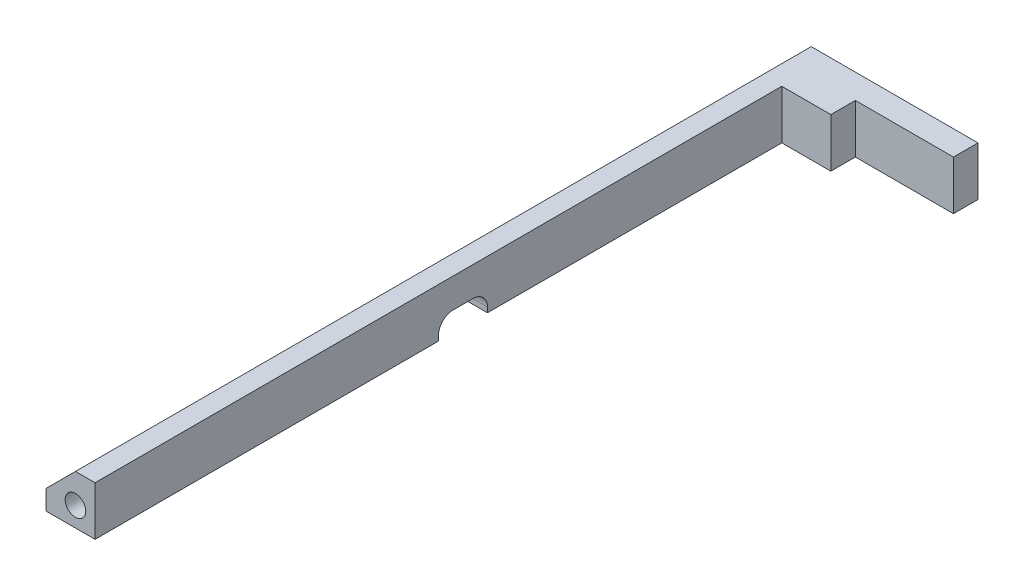
ISO-10303-21;
HEADER;
FILE_DESCRIPTION(('STEP AP214'),'2;1');
FILE_NAME('part.step','',(''),(''),'','','');
FILE_SCHEMA(('AUTOMOTIVE_DESIGN { 1 0 10303 214 1 1 1 1 }'));
ENDSEC;
DATA;
#1=APPLICATION_CONTEXT('core data for automotive mechanical design processes');
#2=APPLICATION_PROTOCOL_DEFINITION('international standard','automotive_design',2000,#1);
#3=PRODUCT_CONTEXT('',#1,'mechanical');
#4=PRODUCT('Part','Part','',(#3));
#5=PRODUCT_RELATED_PRODUCT_CATEGORY('part','',(#4));
#6=PRODUCT_DEFINITION_FORMATION('','',#4);
#7=PRODUCT_DEFINITION_CONTEXT('part definition',#1,'design');
#8=PRODUCT_DEFINITION('design','',#6,#7);
#9=PRODUCT_DEFINITION_SHAPE('','',#8);
#10=(LENGTH_UNIT() NAMED_UNIT(*) SI_UNIT(.MILLI.,.METRE.));
#11=(NAMED_UNIT(*) PLANE_ANGLE_UNIT() SI_UNIT($,.RADIAN.));
#12=(NAMED_UNIT(*) SI_UNIT($,.STERADIAN.) SOLID_ANGLE_UNIT());
#13=UNCERTAINTY_MEASURE_WITH_UNIT(LENGTH_MEASURE(1.E-05),#10,'distance_accuracy_value','');
#14=(GEOMETRIC_REPRESENTATION_CONTEXT(3) GLOBAL_UNCERTAINTY_ASSIGNED_CONTEXT((#13)) GLOBAL_UNIT_ASSIGNED_CONTEXT((#10,
#11,#12)) REPRESENTATION_CONTEXT('',''));
#15=CARTESIAN_POINT('',(0.,0.,0.));
#16=DIRECTION('',(0.,0.,1.));
#17=DIRECTION('',(1.,0.,0.));
#18=AXIS2_PLACEMENT_3D('',#15,#16,#17);
#19=CARTESIAN_POINT('',(0.,10.,0.));
#20=DIRECTION('',(1.,0.,0.));
#21=DIRECTION('',(0.,0.,-1.));
#22=AXIS2_PLACEMENT_3D('',#19,#20,#21);
#23=PLANE('',#22);
#24=DIRECTION('',(0.,0.,-1.));
#25=VECTOR('',#24,1.);
#26=CARTESIAN_POINT('',(0.,3.99999999999997,0.));
#27=LINE('',#26,#25);
#28=CARTESIAN_POINT('',(0.,3.99999999999997,0.));
#29=VERTEX_POINT('',#28);
#30=CARTESIAN_POINT('',(0.,3.99999999999997,-73.));
#31=VERTEX_POINT('',#30);
#32=EDGE_CURVE('E81',#29,#31,#27,.T.);
#33=ORIENTED_EDGE('',*,*,#32,.T.);
#34=CARTESIAN_POINT('',(0.,1.,-73.));
#35=DIRECTION('',(1.,0.,0.));
#36=DIRECTION('',(0.,0.,-1.));
#37=AXIS2_PLACEMENT_3D('',#34,#35,#36);
#38=CIRCLE('',#37,3.);
#39=CARTESIAN_POINT('',(0.,1.,-70.));
#40=VERTEX_POINT('',#39);
#41=EDGE_CURVE('E135',#31,#40,#38,.T.);
#42=ORIENTED_EDGE('',*,*,#41,.T.);
#43=DIRECTION('',(0.,-1.,0.));
#44=VECTOR('',#43,1.);
#45=CARTESIAN_POINT('',(0.,4.,-70.));
#46=LINE('',#45,#44);
#47=CARTESIAN_POINT('',(0.,0.,-70.));
#48=VERTEX_POINT('',#47);
#49=EDGE_CURVE('E112',#40,#48,#46,.T.);
#50=ORIENTED_EDGE('',*,*,#49,.T.);
#51=DIRECTION('',(0.,0.,1.));
#52=VECTOR('',#51,1.);
#53=CARTESIAN_POINT('',(0.,0.,0.));
#54=LINE('',#53,#52);
#55=CARTESIAN_POINT('',(0.,0.,0.));
#56=VERTEX_POINT('',#55);
#57=EDGE_CURVE('E198',#48,#56,#54,.T.);
#58=ORIENTED_EDGE('',*,*,#57,.T.);
#59=DIRECTION('',(0.,-1.,0.));
#60=VECTOR('',#59,1.);
#61=CARTESIAN_POINT('',(0.,10.,0.));
#62=LINE('',#61,#60);
#63=EDGE_CURVE('E188',#29,#56,#62,.T.);
#64=ORIENTED_EDGE('',*,*,#63,.F.);
#65=EDGE_LOOP('',(#33,#42,#50,#58,#64));
#66=FACE_BOUND('',#65,.T.);
#67=ADVANCED_FACE('F42',(#66),#23,.F.);
#68=CARTESIAN_POINT('',(0.,0.,0.));
#69=DIRECTION('',(0.,-1.,0.));
#70=DIRECTION('',(0.,0.,-1.));
#71=AXIS2_PLACEMENT_3D('',#68,#69,#70);
#72=PLANE('',#71);
#73=DIRECTION('',(-1.,0.,0.));
#74=VECTOR('',#73,1.);
#75=CARTESIAN_POINT('',(10.,0.,-70.));
#76=LINE('',#75,#74);
#77=CARTESIAN_POINT('',(10.,0.,-70.));
#78=VERTEX_POINT('',#77);
#79=EDGE_CURVE('E289',#78,#48,#76,.T.);
#80=ORIENTED_EDGE('',*,*,#79,.F.);
#81=DIRECTION('',(0.,0.,-1.));
#82=VECTOR('',#81,1.);
#83=CARTESIAN_POINT('',(9.99999999999998,0.,-140.));
#84=LINE('',#83,#82);
#85=CARTESIAN_POINT('',(10.,0.,0.));
#86=VERTEX_POINT('',#85);
#87=EDGE_CURVE('E126',#86,#78,#84,.T.);
#88=ORIENTED_EDGE('',*,*,#87,.F.);
#89=DIRECTION('',(1.,0.,0.));
#90=VECTOR('',#89,1.);
#91=CARTESIAN_POINT('',(10.,0.,0.));
#92=LINE('',#91,#90);
#93=EDGE_CURVE('E222',#56,#86,#92,.T.);
#94=ORIENTED_EDGE('',*,*,#93,.F.);
#95=ORIENTED_EDGE('',*,*,#57,.F.);
#96=EDGE_LOOP('',(#80,#88,#94,#95));
#97=FACE_BOUND('',#96,.T.);
#98=CARTESIAN_POINT('',(7.2,0.,-27.));
#99=DIRECTION('',(0.,-1.,0.));
#100=DIRECTION('',(0.,0.,-1.));
#101=AXIS2_PLACEMENT_3D('',#98,#99,#100);
#102=CIRCLE('',#101,2.1);
#103=CARTESIAN_POINT('',(7.2,0.,-29.1));
#104=VERTEX_POINT('',#103);
#105=EDGE_CURVE('E262',#104,#104,#102,.T.);
#106=ORIENTED_EDGE('',*,*,#105,.F.);
#107=EDGE_LOOP('',(#106));
#108=FACE_BOUND('',#107,.T.);
#109=ADVANCED_FACE('F334',(#97,#108),#72,.T.);
#110=CARTESIAN_POINT('',(10.,10.,0.));
#111=DIRECTION('',(0.,0.,-1.));
#112=DIRECTION('',(-1.,0.,0.));
#113=AXIS2_PLACEMENT_3D('',#110,#111,#112);
#114=PLANE('',#113);
#115=CARTESIAN_POINT('',(6.,4.,0.));
#116=DIRECTION('',(0.,0.,1.));
#117=DIRECTION('',(1.,0.,0.));
#118=AXIS2_PLACEMENT_3D('',#115,#116,#117);
#119=CIRCLE('',#118,2.1);
#120=CARTESIAN_POINT('',(8.1,4.,0.));
#121=VERTEX_POINT('',#120);
#122=EDGE_CURVE('E128',#121,#121,#119,.T.);
#123=ORIENTED_EDGE('',*,*,#122,.F.);
#124=EDGE_LOOP('',(#123));
#125=FACE_BOUND('',#124,.T.);
#126=DIRECTION('',(1.,0.,0.));
#127=VECTOR('',#126,1.);
#128=CARTESIAN_POINT('',(10.,10.,0.));
#129=LINE('',#128,#127);
#130=CARTESIAN_POINT('',(6.00000000000001,10.,0.));
#131=VERTEX_POINT('',#130);
#132=CARTESIAN_POINT('',(10.,10.,0.));
#133=VERTEX_POINT('',#132);
#134=EDGE_CURVE('E197',#131,#133,#129,.T.);
#135=ORIENTED_EDGE('',*,*,#134,.F.);
#136=DIRECTION('',(0.707106781186546,0.707106781186549,0.));
#137=VECTOR('',#136,1.);
#138=CARTESIAN_POINT('',(6.00000000000001,10.,0.));
#139=LINE('',#138,#137);
#140=EDGE_CURVE('E155',#131,#29,#139,.F.);
#141=ORIENTED_EDGE('',*,*,#140,.T.);
#142=ORIENTED_EDGE('',*,*,#63,.T.);
#143=ORIENTED_EDGE('',*,*,#93,.T.);
#144=DIRECTION('',(0.,-1.,0.));
#145=VECTOR('',#144,1.);
#146=CARTESIAN_POINT('',(10.,10.,0.));
#147=LINE('',#146,#145);
#148=EDGE_CURVE('E162',#133,#86,#147,.T.);
#149=ORIENTED_EDGE('',*,*,#148,.F.);
#150=EDGE_LOOP('',(#135,#141,#142,#143,#149));
#151=FACE_BOUND('',#150,.T.);
#152=ADVANCED_FACE('F330',(#125,#151),#114,.F.);
#153=CARTESIAN_POINT('',(9.99999999999998,10.,-140.));
#154=DIRECTION('',(-1.,0.,0.));
#155=DIRECTION('',(0.,0.,1.));
#156=AXIS2_PLACEMENT_3D('',#153,#154,#155);
#157=PLANE('',#156);
#158=ORIENTED_EDGE('',*,*,#87,.T.);
#159=DIRECTION('',(0.,-1.,0.));
#160=VECTOR('',#159,1.);
#161=CARTESIAN_POINT('',(10.,4.,-70.));
#162=LINE('',#161,#160);
#163=CARTESIAN_POINT('',(10.,1.,-70.));
#164=VERTEX_POINT('',#163);
#165=EDGE_CURVE('E109',#164,#78,#162,.T.);
#166=ORIENTED_EDGE('',*,*,#165,.F.);
#167=CARTESIAN_POINT('',(9.99999999999999,1.,-73.));
#168=DIRECTION('',(-1.,0.,0.));
#169=DIRECTION('',(0.,0.,1.));
#170=AXIS2_PLACEMENT_3D('',#167,#168,#169);
#171=CIRCLE('',#170,3.);
#172=CARTESIAN_POINT('',(10.,4.,-73.));
#173=VERTEX_POINT('',#172);
#174=EDGE_CURVE('E122',#164,#173,#171,.T.);
#175=ORIENTED_EDGE('',*,*,#174,.T.);
#176=DIRECTION('',(0.,0.,1.));
#177=VECTOR('',#176,1.);
#178=CARTESIAN_POINT('',(10.,4.,-80.));
#179=LINE('',#178,#177);
#180=CARTESIAN_POINT('',(10.,4.,-77.));
#181=VERTEX_POINT('',#180);
#182=EDGE_CURVE('E278',#181,#173,#179,.T.);
#183=ORIENTED_EDGE('',*,*,#182,.F.);
#184=CARTESIAN_POINT('',(9.99999999999999,1.,-77.));
#185=DIRECTION('',(-1.,0.,0.));
#186=DIRECTION('',(0.,0.,1.));
#187=AXIS2_PLACEMENT_3D('',#184,#185,#186);
#188=CIRCLE('',#187,3.);
#189=CARTESIAN_POINT('',(10.,1.,-80.));
#190=VERTEX_POINT('',#189);
#191=EDGE_CURVE('E51',#181,#190,#188,.T.);
#192=ORIENTED_EDGE('',*,*,#191,.T.);
#193=DIRECTION('',(0.,-1.,0.));
#194=VECTOR('',#193,1.);
#195=CARTESIAN_POINT('',(10.,4.,-80.));
#196=LINE('',#195,#194);
#197=CARTESIAN_POINT('',(10.,0.,-80.));
#198=VERTEX_POINT('',#197);
#199=EDGE_CURVE('E129',#190,#198,#196,.T.);
#200=ORIENTED_EDGE('',*,*,#199,.T.);
#201=CARTESIAN_POINT('',(9.99999999999998,0.,-140.));
#202=VERTEX_POINT('',#201);
#203=EDGE_CURVE('E221',#198,#202,#84,.T.);
#204=ORIENTED_EDGE('',*,*,#203,.T.);
#205=DIRECTION('',(0.,-1.,0.));
#206=VECTOR('',#205,1.);
#207=CARTESIAN_POINT('',(9.99999999999998,10.,-140.));
#208=LINE('',#207,#206);
#209=CARTESIAN_POINT('',(9.99999999999998,10.,-140.));
#210=VERTEX_POINT('',#209);
#211=EDGE_CURVE('E165',#210,#202,#208,.T.);
#212=ORIENTED_EDGE('',*,*,#211,.F.);
#213=DIRECTION('',(0.,0.,-1.));
#214=VECTOR('',#213,1.);
#215=CARTESIAN_POINT('',(9.99999999999998,10.,-140.));
#216=LINE('',#215,#214);
#217=EDGE_CURVE('E246',#133,#210,#216,.T.);
#218=ORIENTED_EDGE('',*,*,#217,.F.);
#219=ORIENTED_EDGE('',*,*,#148,.T.);
#220=EDGE_LOOP('',(#158,#166,#175,#183,#192,#200,#204,#212,#218,#219));
#221=FACE_BOUND('',#220,.T.);
#222=ADVANCED_FACE('F120',(#221),#157,.F.);
#223=CARTESIAN_POINT('',(20.,10.,-140.));
#224=DIRECTION('',(0.,0.,-1.));
#225=DIRECTION('',(-1.,0.,0.));
#226=AXIS2_PLACEMENT_3D('',#223,#224,#225);
#227=PLANE('',#226);
#228=DIRECTION('',(1.,0.,0.));
#229=VECTOR('',#228,1.);
#230=CARTESIAN_POINT('',(20.,0.,-140.));
#231=LINE('',#230,#229);
#232=CARTESIAN_POINT('',(20.,0.,-140.));
#233=VERTEX_POINT('',#232);
#234=EDGE_CURVE('E215',#202,#233,#231,.T.);
#235=ORIENTED_EDGE('',*,*,#234,.T.);
#236=DIRECTION('',(0.,-1.,0.));
#237=VECTOR('',#236,1.);
#238=CARTESIAN_POINT('',(20.,10.,-140.));
#239=LINE('',#238,#237);
#240=CARTESIAN_POINT('',(20.,10.,-140.));
#241=VERTEX_POINT('',#240);
#242=EDGE_CURVE('E169',#241,#233,#239,.T.);
#243=ORIENTED_EDGE('',*,*,#242,.F.);
#244=DIRECTION('',(1.,0.,0.));
#245=VECTOR('',#244,1.);
#246=CARTESIAN_POINT('',(20.,10.,-140.));
#247=LINE('',#246,#245);
#248=EDGE_CURVE('E242',#210,#241,#247,.T.);
#249=ORIENTED_EDGE('',*,*,#248,.F.);
#250=ORIENTED_EDGE('',*,*,#211,.T.);
#251=EDGE_LOOP('',(#235,#243,#249,#250));
#252=FACE_BOUND('',#251,.T.);
#253=ADVANCED_FACE('F414',(#252),#227,.F.);
#254=CARTESIAN_POINT('',(20.,10.,-145.));
#255=DIRECTION('',(-1.,0.,0.));
#256=DIRECTION('',(0.,0.,1.));
#257=AXIS2_PLACEMENT_3D('',#254,#255,#256);
#258=PLANE('',#257);
#259=DIRECTION('',(0.,0.,-1.));
#260=VECTOR('',#259,1.);
#261=CARTESIAN_POINT('',(20.,0.,-145.));
#262=LINE('',#261,#260);
#263=CARTESIAN_POINT('',(20.,0.,-145.));
#264=VERTEX_POINT('',#263);
#265=EDGE_CURVE('E211',#233,#264,#262,.T.);
#266=ORIENTED_EDGE('',*,*,#265,.T.);
#267=DIRECTION('',(0.,-1.,0.));
#268=VECTOR('',#267,1.);
#269=CARTESIAN_POINT('',(20.,10.,-145.));
#270=LINE('',#269,#268);
#271=CARTESIAN_POINT('',(20.,10.,-145.));
#272=VERTEX_POINT('',#271);
#273=EDGE_CURVE('E173',#272,#264,#270,.T.);
#274=ORIENTED_EDGE('',*,*,#273,.F.);
#275=DIRECTION('',(0.,0.,-1.));
#276=VECTOR('',#275,1.);
#277=CARTESIAN_POINT('',(20.,10.,-145.));
#278=LINE('',#277,#276);
#279=EDGE_CURVE('E238',#241,#272,#278,.T.);
#280=ORIENTED_EDGE('',*,*,#279,.F.);
#281=ORIENTED_EDGE('',*,*,#242,.T.);
#282=EDGE_LOOP('',(#266,#274,#280,#281));
#283=FACE_BOUND('',#282,.T.);
#284=ADVANCED_FACE('F410',(#283),#258,.F.);
#285=CARTESIAN_POINT('',(40.,10.,-145.));
#286=DIRECTION('',(0.,0.,-1.));
#287=DIRECTION('',(-1.,0.,0.));
#288=AXIS2_PLACEMENT_3D('',#285,#286,#287);
#289=PLANE('',#288);
#290=DIRECTION('',(1.,0.,0.));
#291=VECTOR('',#290,1.);
#292=CARTESIAN_POINT('',(40.,0.,-145.));
#293=LINE('',#292,#291);
#294=CARTESIAN_POINT('',(40.,0.,-145.));
#295=VERTEX_POINT('',#294);
#296=EDGE_CURVE('E207',#264,#295,#293,.T.);
#297=ORIENTED_EDGE('',*,*,#296,.T.);
#298=DIRECTION('',(0.,-1.,0.));
#299=VECTOR('',#298,1.);
#300=CARTESIAN_POINT('',(40.,10.,-145.));
#301=LINE('',#300,#299);
#302=CARTESIAN_POINT('',(40.,10.,-145.));
#303=VERTEX_POINT('',#302);
#304=EDGE_CURVE('E177',#303,#295,#301,.T.);
#305=ORIENTED_EDGE('',*,*,#304,.F.);
#306=DIRECTION('',(1.,0.,0.));
#307=VECTOR('',#306,1.);
#308=CARTESIAN_POINT('',(40.,10.,-145.));
#309=LINE('',#308,#307);
#310=EDGE_CURVE('E234',#272,#303,#309,.T.);
#311=ORIENTED_EDGE('',*,*,#310,.F.);
#312=ORIENTED_EDGE('',*,*,#273,.T.);
#313=EDGE_LOOP('',(#297,#305,#311,#312));
#314=FACE_BOUND('',#313,.T.);
#315=ADVANCED_FACE('F404',(#314),#289,.F.);
#316=CARTESIAN_POINT('',(40.,10.,-150.));
#317=DIRECTION('',(-1.,0.,0.));
#318=DIRECTION('',(0.,0.,1.));
#319=AXIS2_PLACEMENT_3D('',#316,#317,#318);
#320=PLANE('',#319);
#321=DIRECTION('',(0.,0.,-1.));
#322=VECTOR('',#321,1.);
#323=CARTESIAN_POINT('',(40.,0.,-150.));
#324=LINE('',#323,#322);
#325=CARTESIAN_POINT('',(40.,0.,-150.));
#326=VERTEX_POINT('',#325);
#327=EDGE_CURVE('E203',#295,#326,#324,.T.);
#328=ORIENTED_EDGE('',*,*,#327,.T.);
#329=DIRECTION('',(0.,-1.,0.));
#330=VECTOR('',#329,1.);
#331=CARTESIAN_POINT('',(40.,10.,-150.));
#332=LINE('',#331,#330);
#333=CARTESIAN_POINT('',(40.,10.,-150.));
#334=VERTEX_POINT('',#333);
#335=EDGE_CURVE('E181',#334,#326,#332,.T.);
#336=ORIENTED_EDGE('',*,*,#335,.F.);
#337=DIRECTION('',(0.,0.,-1.));
#338=VECTOR('',#337,1.);
#339=CARTESIAN_POINT('',(40.,10.,-150.));
#340=LINE('',#339,#338);
#341=EDGE_CURVE('E230',#303,#334,#340,.T.);
#342=ORIENTED_EDGE('',*,*,#341,.F.);
#343=ORIENTED_EDGE('',*,*,#304,.T.);
#344=EDGE_LOOP('',(#328,#336,#342,#343));
#345=FACE_BOUND('',#344,.T.);
#346=ADVANCED_FACE('F399',(#345),#320,.F.);
#347=CARTESIAN_POINT('',(0.,10.,-150.));
#348=DIRECTION('',(0.,0.,1.));
#349=DIRECTION('',(1.,0.,0.));
#350=AXIS2_PLACEMENT_3D('',#347,#348,#349);
#351=PLANE('',#350);
#352=DIRECTION('',(0.,-1.,0.));
#353=VECTOR('',#352,1.);
#354=CARTESIAN_POINT('',(0.,10.,-150.));
#355=LINE('',#354,#353);
#356=CARTESIAN_POINT('',(0.,3.99999999999997,-150.));
#357=VERTEX_POINT('',#356);
#358=CARTESIAN_POINT('',(0.,0.,-150.));
#359=VERTEX_POINT('',#358);
#360=EDGE_CURVE('E185',#357,#359,#355,.T.);
#361=ORIENTED_EDGE('',*,*,#360,.F.);
#362=DIRECTION('',(-0.707106781186546,-0.707106781186549,0.));
#363=VECTOR('',#362,1.);
#364=CARTESIAN_POINT('',(6.00000000000001,10.,-150.));
#365=LINE('',#364,#363);
#366=CARTESIAN_POINT('',(6.00000000000001,10.,-150.));
#367=VERTEX_POINT('',#366);
#368=EDGE_CURVE('E149',#357,#367,#365,.F.);
#369=ORIENTED_EDGE('',*,*,#368,.T.);
#370=DIRECTION('',(-1.,0.,0.));
#371=VECTOR('',#370,1.);
#372=CARTESIAN_POINT('',(0.,10.,-150.));
#373=LINE('',#372,#371);
#374=EDGE_CURVE('E192',#334,#367,#373,.T.);
#375=ORIENTED_EDGE('',*,*,#374,.F.);
#376=ORIENTED_EDGE('',*,*,#335,.T.);
#377=DIRECTION('',(-1.,0.,0.));
#378=VECTOR('',#377,1.);
#379=CARTESIAN_POINT('',(0.,0.,-150.));
#380=LINE('',#379,#378);
#381=EDGE_CURVE('E199',#326,#359,#380,.T.);
#382=ORIENTED_EDGE('',*,*,#381,.T.);
#383=EDGE_LOOP('',(#361,#369,#375,#376,#382));
#384=FACE_BOUND('',#383,.T.);
#385=ADVANCED_FACE('F365',(#384),#351,.F.);
#386=CARTESIAN_POINT('',(0.,0.,-80.));
#387=VERTEX_POINT('',#386);
#388=EDGE_CURVE('E193',#359,#387,#54,.T.);
#389=ORIENTED_EDGE('',*,*,#388,.T.);
#390=DIRECTION('',(0.,-1.,0.));
#391=VECTOR('',#390,1.);
#392=CARTESIAN_POINT('',(0.,4.,-80.));
#393=LINE('',#392,#391);
#394=CARTESIAN_POINT('',(0.,1.,-80.));
#395=VERTEX_POINT('',#394);
#396=EDGE_CURVE('E277',#395,#387,#393,.T.);
#397=ORIENTED_EDGE('',*,*,#396,.F.);
#398=CARTESIAN_POINT('',(0.,1.,-77.));
#399=DIRECTION('',(1.,0.,0.));
#400=DIRECTION('',(0.,0.,-1.));
#401=AXIS2_PLACEMENT_3D('',#398,#399,#400);
#402=CIRCLE('',#401,3.);
#403=CARTESIAN_POINT('',(0.,4.,-77.));
#404=VERTEX_POINT('',#403);
#405=EDGE_CURVE('E11',#395,#404,#402,.T.);
#406=ORIENTED_EDGE('',*,*,#405,.T.);
#407=EDGE_CURVE('E58',#404,#357,#27,.T.);
#408=ORIENTED_EDGE('',*,*,#407,.T.);
#409=ORIENTED_EDGE('',*,*,#360,.T.);
#410=EDGE_LOOP('',(#389,#397,#406,#408,#409));
#411=FACE_BOUND('',#410,.T.);
#412=ADVANCED_FACE('F299',(#411),#23,.F.);
#413=CARTESIAN_POINT('',(0.,10.,0.));
#414=DIRECTION('',(0.,-1.,0.));
#415=DIRECTION('',(0.,0.,-1.));
#416=AXIS2_PLACEMENT_3D('',#413,#414,#415);
#417=PLANE('',#416);
#418=ORIENTED_EDGE('',*,*,#374,.T.);
#419=DIRECTION('',(0.,0.,1.));
#420=VECTOR('',#419,1.);
#421=CARTESIAN_POINT('',(6.00000000000001,10.,0.));
#422=LINE('',#421,#420);
#423=EDGE_CURVE('E158',#367,#131,#422,.T.);
#424=ORIENTED_EDGE('',*,*,#423,.T.);
#425=ORIENTED_EDGE('',*,*,#134,.T.);
#426=ORIENTED_EDGE('',*,*,#217,.T.);
#427=ORIENTED_EDGE('',*,*,#248,.T.);
#428=ORIENTED_EDGE('',*,*,#279,.T.);
#429=ORIENTED_EDGE('',*,*,#310,.T.);
#430=ORIENTED_EDGE('',*,*,#341,.T.);
#431=EDGE_LOOP('',(#418,#424,#425,#426,#427,#428,#429,#430));
#432=FACE_BOUND('',#431,.T.);
#433=ADVANCED_FACE('F367',(#432),#417,.F.);
#434=DIRECTION('',(1.,0.,0.));
#435=VECTOR('',#434,1.);
#436=CARTESIAN_POINT('',(0.,0.,-80.));
#437=LINE('',#436,#435);
#438=EDGE_CURVE('E284',#387,#198,#437,.T.);
#439=ORIENTED_EDGE('',*,*,#438,.F.);
#440=ORIENTED_EDGE('',*,*,#388,.F.);
#441=ORIENTED_EDGE('',*,*,#381,.F.);
#442=ORIENTED_EDGE('',*,*,#327,.F.);
#443=ORIENTED_EDGE('',*,*,#296,.F.);
#444=ORIENTED_EDGE('',*,*,#265,.F.);
#445=ORIENTED_EDGE('',*,*,#234,.F.);
#446=ORIENTED_EDGE('',*,*,#203,.F.);
#447=EDGE_LOOP('',(#439,#440,#441,#442,#443,#444,#445,#446));
#448=FACE_BOUND('',#447,.T.);
#449=CARTESIAN_POINT('',(7.20000000000002,0.,-123.));
#450=DIRECTION('',(0.,-1.,0.));
#451=DIRECTION('',(0.,0.,-1.));
#452=AXIS2_PLACEMENT_3D('',#449,#450,#451);
#453=CIRCLE('',#452,2.1);
#454=CARTESIAN_POINT('',(7.20000000000002,0.,-125.1));
#455=VERTEX_POINT('',#454);
#456=EDGE_CURVE('E253',#455,#455,#453,.T.);
#457=ORIENTED_EDGE('',*,*,#456,.F.);
#458=EDGE_LOOP('',(#457));
#459=FACE_BOUND('',#458,.T.);
#460=ADVANCED_FACE('F311',(#448,#459),#72,.T.);
#461=CARTESIAN_POINT('',(7.20000000000002,4.,-123.));
#462=DIRECTION('',(0.,-1.,0.));
#463=DIRECTION('',(0.,0.,-1.));
#464=AXIS2_PLACEMENT_3D('',#461,#462,#463);
#465=CYLINDRICAL_SURFACE('',#464,2.1);
#466=CARTESIAN_POINT('',(7.20000000000002,4.,-123.));
#467=DIRECTION('',(0.,-1.,0.));
#468=DIRECTION('',(0.,0.,-1.));
#469=AXIS2_PLACEMENT_3D('',#466,#467,#468);
#470=CIRCLE('',#469,2.1);
#471=CARTESIAN_POINT('',(7.20000000000002,4.,-125.1));
#472=VERTEX_POINT('',#471);
#473=EDGE_CURVE('E257',#472,#472,#470,.T.);
#474=ORIENTED_EDGE('',*,*,#473,.F.);
#475=EDGE_LOOP('',(#474));
#476=FACE_BOUND('',#475,.T.);
#477=ORIENTED_EDGE('',*,*,#456,.T.);
#478=EDGE_LOOP('',(#477));
#479=FACE_BOUND('',#478,.T.);
#480=ADVANCED_FACE('F445',(#476,#479),#465,.F.);
#481=CARTESIAN_POINT('',(7.20000000000002,4.,-123.));
#482=DIRECTION('',(0.,-1.,0.));
#483=DIRECTION('',(0.,0.,-1.));
#484=AXIS2_PLACEMENT_3D('',#481,#482,#483);
#485=PLANE('',#484);
#486=ORIENTED_EDGE('',*,*,#473,.T.);
#487=EDGE_LOOP('',(#486));
#488=FACE_BOUND('',#487,.T.);
#489=ADVANCED_FACE('F441',(#488),#485,.T.);
#490=CARTESIAN_POINT('',(7.2,4.,-27.));
#491=DIRECTION('',(0.,-1.,0.));
#492=DIRECTION('',(0.,0.,-1.));
#493=AXIS2_PLACEMENT_3D('',#490,#491,#492);
#494=CYLINDRICAL_SURFACE('',#493,2.1);
#495=CARTESIAN_POINT('',(7.2,4.,-27.));
#496=DIRECTION('',(0.,-1.,0.));
#497=DIRECTION('',(0.,0.,-1.));
#498=AXIS2_PLACEMENT_3D('',#495,#496,#497);
#499=CIRCLE('',#498,2.1);
#500=CARTESIAN_POINT('',(7.2,4.,-29.1));
#501=VERTEX_POINT('',#500);
#502=EDGE_CURVE('E226',#501,#501,#499,.T.);
#503=ORIENTED_EDGE('',*,*,#502,.F.);
#504=EDGE_LOOP('',(#503));
#505=FACE_BOUND('',#504,.T.);
#506=ORIENTED_EDGE('',*,*,#105,.T.);
#507=EDGE_LOOP('',(#506));
#508=FACE_BOUND('',#507,.T.);
#509=ADVANCED_FACE('F434',(#505,#508),#494,.F.);
#510=CARTESIAN_POINT('',(7.2,4.,-27.));
#511=DIRECTION('',(0.,-1.,0.));
#512=DIRECTION('',(0.,0.,-1.));
#513=AXIS2_PLACEMENT_3D('',#510,#511,#512);
#514=PLANE('',#513);
#515=ORIENTED_EDGE('',*,*,#502,.T.);
#516=EDGE_LOOP('',(#515));
#517=FACE_BOUND('',#516,.T.);
#518=ADVANCED_FACE('F428',(#517),#514,.T.);
#519=CARTESIAN_POINT('',(6.,4.,-4.));
#520=DIRECTION('',(0.,0.,1.));
#521=DIRECTION('',(1.,0.,0.));
#522=AXIS2_PLACEMENT_3D('',#519,#520,#521);
#523=CYLINDRICAL_SURFACE('',#522,2.1);
#524=CARTESIAN_POINT('',(6.,4.,-4.));
#525=DIRECTION('',(0.,0.,1.));
#526=DIRECTION('',(1.,0.,0.));
#527=AXIS2_PLACEMENT_3D('',#524,#525,#526);
#528=CIRCLE('',#527,2.1);
#529=CARTESIAN_POINT('',(8.1,4.,-4.));
#530=VERTEX_POINT('',#529);
#531=EDGE_CURVE('E258',#530,#530,#528,.T.);
#532=ORIENTED_EDGE('',*,*,#531,.F.);
#533=EDGE_LOOP('',(#532));
#534=FACE_BOUND('',#533,.T.);
#535=ORIENTED_EDGE('',*,*,#122,.T.);
#536=EDGE_LOOP('',(#535));
#537=FACE_BOUND('',#536,.T.);
#538=ADVANCED_FACE('F381',(#534,#537),#523,.F.);
#539=CARTESIAN_POINT('',(6.,4.,-4.));
#540=DIRECTION('',(0.,0.,1.));
#541=DIRECTION('',(1.,0.,0.));
#542=AXIS2_PLACEMENT_3D('',#539,#540,#541);
#543=PLANE('',#542);
#544=ORIENTED_EDGE('',*,*,#531,.T.);
#545=EDGE_LOOP('',(#544));
#546=FACE_BOUND('',#545,.T.);
#547=ADVANCED_FACE('F372',(#546),#543,.T.);
#548=CARTESIAN_POINT('',(6.00000000000001,10.,0.));
#549=DIRECTION('',(0.707106781186549,-0.707106781186546,0.));
#550=DIRECTION('',(0.,0.,1.));
#551=AXIS2_PLACEMENT_3D('',#548,#549,#550);
#552=PLANE('',#551);
#553=ORIENTED_EDGE('',*,*,#368,.F.);
#554=ORIENTED_EDGE('',*,*,#407,.F.);
#555=DIRECTION('',(0.,0.,-1.));
#556=VECTOR('',#555,1.);
#557=CARTESIAN_POINT('',(0.,4.,-70.));
#558=LINE('',#557,#556);
#559=EDGE_CURVE('E288',#31,#404,#558,.T.);
#560=ORIENTED_EDGE('',*,*,#559,.F.);
#561=ORIENTED_EDGE('',*,*,#32,.F.);
#562=ORIENTED_EDGE('',*,*,#140,.F.);
#563=ORIENTED_EDGE('',*,*,#423,.F.);
#564=EDGE_LOOP('',(#553,#554,#560,#561,#562,#563));
#565=FACE_BOUND('',#564,.T.);
#566=ADVANCED_FACE('F370',(#565),#552,.F.);
#567=CARTESIAN_POINT('',(10.,4.,-70.));
#568=DIRECTION('',(0.,0.,1.));
#569=DIRECTION('',(1.,0.,0.));
#570=AXIS2_PLACEMENT_3D('',#567,#568,#569);
#571=PLANE('',#570);
#572=ORIENTED_EDGE('',*,*,#49,.F.);
#573=DIRECTION('',(-1.,0.,0.));
#574=VECTOR('',#573,1.);
#575=CARTESIAN_POINT('',(10.,1.,-70.));
#576=LINE('',#575,#574);
#577=EDGE_CURVE('E104',#40,#164,#576,.F.);
#578=ORIENTED_EDGE('',*,*,#577,.T.);
#579=ORIENTED_EDGE('',*,*,#165,.T.);
#580=ORIENTED_EDGE('',*,*,#79,.T.);
#581=EDGE_LOOP('',(#572,#578,#579,#580));
#582=FACE_BOUND('',#581,.T.);
#583=ADVANCED_FACE('F106',(#582),#571,.F.);
#584=CARTESIAN_POINT('',(0.,4.,-80.));
#585=DIRECTION('',(0.,0.,-1.));
#586=DIRECTION('',(-1.,0.,0.));
#587=AXIS2_PLACEMENT_3D('',#584,#585,#586);
#588=PLANE('',#587);
#589=ORIENTED_EDGE('',*,*,#199,.F.);
#590=DIRECTION('',(1.,0.,0.));
#591=VECTOR('',#590,1.);
#592=CARTESIAN_POINT('',(0.,1.,-80.));
#593=LINE('',#592,#591);
#594=EDGE_CURVE('E67',#190,#395,#593,.F.);
#595=ORIENTED_EDGE('',*,*,#594,.T.);
#596=ORIENTED_EDGE('',*,*,#396,.T.);
#597=ORIENTED_EDGE('',*,*,#438,.T.);
#598=EDGE_LOOP('',(#589,#595,#596,#597));
#599=FACE_BOUND('',#598,.T.);
#600=ADVANCED_FACE('F303',(#599),#588,.F.);
#601=CARTESIAN_POINT('',(0.,4.,0.));
#602=DIRECTION('',(0.,-1.,0.));
#603=DIRECTION('',(0.,0.,-1.));
#604=AXIS2_PLACEMENT_3D('',#601,#602,#603);
#605=PLANE('',#604);
#606=ORIENTED_EDGE('',*,*,#182,.T.);
#607=DIRECTION('',(-1.,0.,0.));
#608=VECTOR('',#607,1.);
#609=CARTESIAN_POINT('',(1.01307850997046E-13,4.,-73.));
#610=LINE('',#609,#608);
#611=EDGE_CURVE('E116',#173,#31,#610,.T.);
#612=ORIENTED_EDGE('',*,*,#611,.T.);
#613=ORIENTED_EDGE('',*,*,#559,.T.);
#614=DIRECTION('',(1.,0.,0.));
#615=VECTOR('',#614,1.);
#616=CARTESIAN_POINT('',(0.,4.,-77.));
#617=LINE('',#616,#615);
#618=EDGE_CURVE('E145',#404,#181,#617,.T.);
#619=ORIENTED_EDGE('',*,*,#618,.T.);
#620=EDGE_LOOP('',(#606,#612,#613,#619));
#621=FACE_BOUND('',#620,.T.);
#622=ADVANCED_FACE('F296',(#621),#605,.T.);
#623=CARTESIAN_POINT('',(1.01307850997046E-13,1.,-73.));
#624=DIRECTION('',(-1.,0.,0.));
#625=DIRECTION('',(0.,0.,1.));
#626=AXIS2_PLACEMENT_3D('',#623,#624,#625);
#627=CYLINDRICAL_SURFACE('',#626,3.);
#628=ORIENTED_EDGE('',*,*,#174,.F.);
#629=ORIENTED_EDGE('',*,*,#577,.F.);
#630=ORIENTED_EDGE('',*,*,#41,.F.);
#631=ORIENTED_EDGE('',*,*,#611,.F.);
#632=EDGE_LOOP('',(#628,#629,#630,#631));
#633=FACE_BOUND('',#632,.T.);
#634=ADVANCED_FACE('F132',(#633),#627,.F.);
#635=CARTESIAN_POINT('',(0.,1.,-77.));
#636=DIRECTION('',(1.,0.,0.));
#637=DIRECTION('',(0.,0.,-1.));
#638=AXIS2_PLACEMENT_3D('',#635,#636,#637);
#639=CYLINDRICAL_SURFACE('',#638,3.);
#640=ORIENTED_EDGE('',*,*,#405,.F.);
#641=ORIENTED_EDGE('',*,*,#594,.F.);
#642=ORIENTED_EDGE('',*,*,#191,.F.);
#643=ORIENTED_EDGE('',*,*,#618,.F.);
#644=EDGE_LOOP('',(#640,#641,#642,#643));
#645=FACE_BOUND('',#644,.T.);
#646=ADVANCED_FACE('F44',(#645),#639,.F.);
#647=CLOSED_SHELL('',(#67,#109,#152,#222,#253,#284,#315,#346,#385,#412,#433,#460,#480,#489,#509,
#518,#538,#547,#566,#583,#600,#622,#634,#646));
#648=MANIFOLD_SOLID_BREP('B2',#647);
#649=ADVANCED_BREP_SHAPE_REPRESENTATION('',(#18,#648),#14);
#650=SHAPE_DEFINITION_REPRESENTATION(#9,#649);
ENDSEC;
END-ISO-10303-21;
